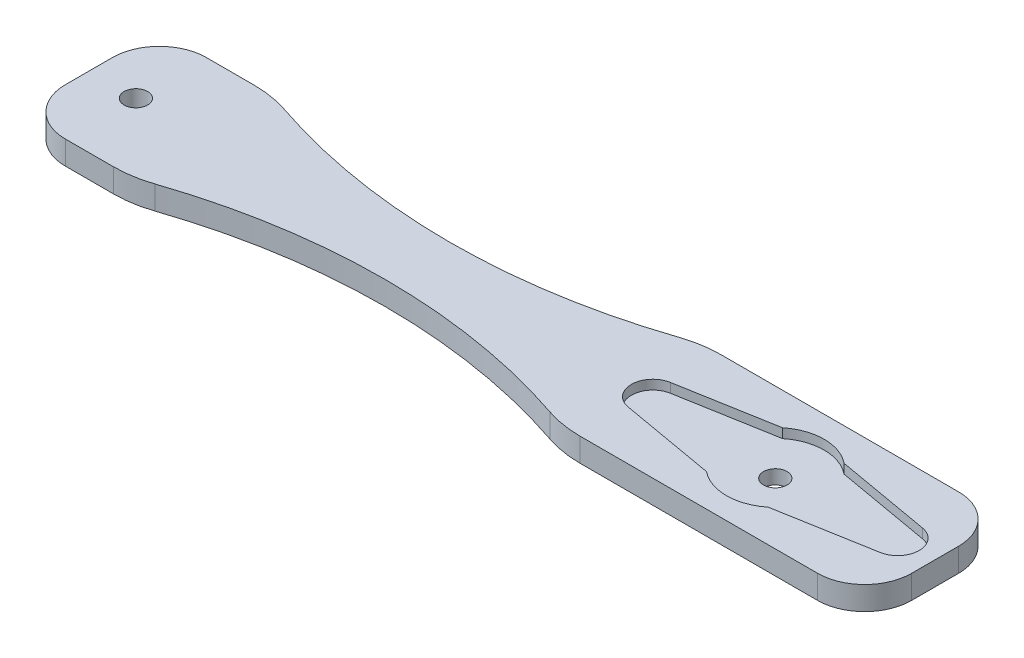
ISO-10303-21;
HEADER;
FILE_DESCRIPTION(('STEP AP214'),'2;1');
FILE_NAME('part.step','',(''),(''),'','','');
FILE_SCHEMA(('AUTOMOTIVE_DESIGN { 1 0 10303 214 1 1 1 1 }'));
ENDSEC;
DATA;
#1=APPLICATION_CONTEXT('core data for automotive mechanical design processes');
#2=APPLICATION_PROTOCOL_DEFINITION('international standard','automotive_design',2000,#1);
#3=PRODUCT_CONTEXT('',#1,'mechanical');
#4=PRODUCT('Part','Part','',(#3));
#5=PRODUCT_RELATED_PRODUCT_CATEGORY('part','',(#4));
#6=PRODUCT_DEFINITION_FORMATION('','',#4);
#7=PRODUCT_DEFINITION_CONTEXT('part definition',#1,'design');
#8=PRODUCT_DEFINITION('design','',#6,#7);
#9=PRODUCT_DEFINITION_SHAPE('','',#8);
#10=(LENGTH_UNIT() NAMED_UNIT(*) SI_UNIT(.MILLI.,.METRE.));
#11=(NAMED_UNIT(*) PLANE_ANGLE_UNIT() SI_UNIT($,.RADIAN.));
#12=(NAMED_UNIT(*) SI_UNIT($,.STERADIAN.) SOLID_ANGLE_UNIT());
#13=UNCERTAINTY_MEASURE_WITH_UNIT(LENGTH_MEASURE(1.E-05),#10,'distance_accuracy_value','');
#14=(GEOMETRIC_REPRESENTATION_CONTEXT(3) GLOBAL_UNCERTAINTY_ASSIGNED_CONTEXT((#13)) GLOBAL_UNIT_ASSIGNED_CONTEXT((#10,
#11,#12)) REPRESENTATION_CONTEXT('',''));
#15=CARTESIAN_POINT('',(0.,0.,0.));
#16=DIRECTION('',(0.,0.,1.));
#17=DIRECTION('',(1.,0.,0.));
#18=AXIS2_PLACEMENT_3D('',#15,#16,#17);
#19=CARTESIAN_POINT('',(6.35000000000004,3.175,-19.05));
#20=DIRECTION('',(0.,0.,1.));
#21=DIRECTION('',(1.,0.,0.));
#22=AXIS2_PLACEMENT_3D('',#19,#20,#21);
#23=PLANE('',#22);
#24=DIRECTION('',(-1.,0.,0.));
#25=VECTOR('',#24,1.);
#26=CARTESIAN_POINT('',(6.35000000000004,0.,-19.05));
#27=LINE('',#26,#25);
#28=CARTESIAN_POINT('',(107.95,0.,-19.05));
#29=VERTEX_POINT('',#28);
#30=CARTESIAN_POINT('',(75.8426747911721,0.,-19.05));
#31=VERTEX_POINT('',#30);
#32=EDGE_CURVE('E304',#29,#31,#27,.T.);
#33=ORIENTED_EDGE('',*,*,#32,.T.);
#34=DIRECTION('',(0.,1.,0.));
#35=VECTOR('',#34,1.);
#36=CARTESIAN_POINT('',(75.8426747911722,3.175,-19.05));
#37=LINE('',#36,#35);
#38=CARTESIAN_POINT('',(75.8426747911721,3.175,-19.05));
#39=VERTEX_POINT('',#38);
#40=EDGE_CURVE('E43',#31,#39,#37,.T.);
#41=ORIENTED_EDGE('',*,*,#40,.T.);
#42=DIRECTION('',(-1.,0.,0.));
#43=VECTOR('',#42,1.);
#44=CARTESIAN_POINT('',(6.35000000000004,3.175,-19.05));
#45=LINE('',#44,#43);
#46=CARTESIAN_POINT('',(107.95,3.175,-19.05));
#47=VERTEX_POINT('',#46);
#48=EDGE_CURVE('E283',#47,#39,#45,.T.);
#49=ORIENTED_EDGE('',*,*,#48,.F.);
#50=DIRECTION('',(0.,-1.,0.));
#51=VECTOR('',#50,1.);
#52=CARTESIAN_POINT('',(107.95,3.175,-19.05));
#53=LINE('',#52,#51);
#54=EDGE_CURVE('E330',#47,#29,#53,.T.);
#55=ORIENTED_EDGE('',*,*,#54,.T.);
#56=EDGE_LOOP('',(#33,#41,#49,#55));
#57=FACE_BOUND('',#56,.T.);
#58=ADVANCED_FACE('F34',(#57),#23,.F.);
#59=CARTESIAN_POINT('',(6.35000000000004,3.175,0.));
#60=DIRECTION('',(0.,0.,-1.));
#61=DIRECTION('',(-1.,0.,0.));
#62=AXIS2_PLACEMENT_3D('',#59,#60,#61);
#63=PLANE('',#62);
#64=DIRECTION('',(1.,0.,0.));
#65=VECTOR('',#64,1.);
#66=CARTESIAN_POINT('',(6.35000000000004,0.,0.));
#67=LINE('',#66,#65);
#68=CARTESIAN_POINT('',(6.35000000000004,0.,0.));
#69=VERTEX_POINT('',#68);
#70=CARTESIAN_POINT('',(12.8485787415568,0.,0.));
#71=VERTEX_POINT('',#70);
#72=EDGE_CURVE('E278',#69,#71,#67,.T.);
#73=ORIENTED_EDGE('',*,*,#72,.T.);
#74=DIRECTION('',(0.,1.,0.));
#75=VECTOR('',#74,1.);
#76=CARTESIAN_POINT('',(12.8485787415568,3.175,0.));
#77=LINE('',#76,#75);
#78=CARTESIAN_POINT('',(12.8485787415568,3.175,0.));
#79=VERTEX_POINT('',#78);
#80=EDGE_CURVE('E339',#71,#79,#77,.T.);
#81=ORIENTED_EDGE('',*,*,#80,.T.);
#82=DIRECTION('',(1.,0.,0.));
#83=VECTOR('',#82,1.);
#84=CARTESIAN_POINT('',(6.35000000000004,3.175,0.));
#85=LINE('',#84,#83);
#86=CARTESIAN_POINT('',(6.35000000000004,3.175,0.));
#87=VERTEX_POINT('',#86);
#88=EDGE_CURVE('E293',#87,#79,#85,.T.);
#89=ORIENTED_EDGE('',*,*,#88,.F.);
#90=DIRECTION('',(0.,-1.,0.));
#91=VECTOR('',#90,1.);
#92=CARTESIAN_POINT('',(6.35000000000004,3.175,0.));
#93=LINE('',#92,#91);
#94=EDGE_CURVE('E318',#87,#69,#93,.T.);
#95=ORIENTED_EDGE('',*,*,#94,.T.);
#96=EDGE_LOOP('',(#73,#81,#89,#95));
#97=FACE_BOUND('',#96,.T.);
#98=ADVANCED_FACE('F427',(#97),#63,.F.);
#99=CARTESIAN_POINT('',(107.95,3.175,-6.35));
#100=DIRECTION('',(0.,-1.,0.));
#101=DIRECTION('',(0.,0.,-1.));
#102=AXIS2_PLACEMENT_3D('',#99,#100,#101);
#103=CYLINDRICAL_SURFACE('',#102,6.35);
#104=CARTESIAN_POINT('',(107.95,0.,-6.35));
#105=DIRECTION('',(0.,1.,0.));
#106=DIRECTION('',(0.,0.,-1.));
#107=AXIS2_PLACEMENT_3D('',#104,#105,#106);
#108=CIRCLE('',#107,6.35);
#109=CARTESIAN_POINT('',(107.95,0.,0.));
#110=VERTEX_POINT('',#109);
#111=CARTESIAN_POINT('',(114.3,0.,-6.35));
#112=VERTEX_POINT('',#111);
#113=EDGE_CURVE('E262',#110,#112,#108,.T.);
#114=ORIENTED_EDGE('',*,*,#113,.T.);
#115=DIRECTION('',(0.,-1.,0.));
#116=VECTOR('',#115,1.);
#117=CARTESIAN_POINT('',(114.3,3.175,-6.35));
#118=LINE('',#117,#116);
#119=CARTESIAN_POINT('',(114.3,3.175,-6.35));
#120=VERTEX_POINT('',#119);
#121=EDGE_CURVE('E336',#120,#112,#118,.T.);
#122=ORIENTED_EDGE('',*,*,#121,.F.);
#123=CARTESIAN_POINT('',(107.95,3.175,-6.35));
#124=DIRECTION('',(0.,1.,0.));
#125=DIRECTION('',(0.,0.,-1.));
#126=AXIS2_PLACEMENT_3D('',#123,#124,#125);
#127=CIRCLE('',#126,6.35);
#128=CARTESIAN_POINT('',(107.95,3.175,0.));
#129=VERTEX_POINT('',#128);
#130=EDGE_CURVE('E274',#129,#120,#127,.T.);
#131=ORIENTED_EDGE('',*,*,#130,.F.);
#132=DIRECTION('',(0.,-1.,0.));
#133=VECTOR('',#132,1.);
#134=CARTESIAN_POINT('',(107.95,3.175,0.));
#135=LINE('',#134,#133);
#136=EDGE_CURVE('E296',#129,#110,#135,.T.);
#137=ORIENTED_EDGE('',*,*,#136,.T.);
#138=EDGE_LOOP('',(#114,#122,#131,#137));
#139=FACE_BOUND('',#138,.T.);
#140=ADVANCED_FACE('F433',(#139),#103,.T.);
#141=CARTESIAN_POINT('',(114.3,3.175,-6.35));
#142=DIRECTION('',(-1.,0.,0.));
#143=DIRECTION('',(0.,0.,1.));
#144=AXIS2_PLACEMENT_3D('',#141,#142,#143);
#145=PLANE('',#144);
#146=DIRECTION('',(0.,0.,-1.));
#147=VECTOR('',#146,1.);
#148=CARTESIAN_POINT('',(114.3,0.,-6.35));
#149=LINE('',#148,#147);
#150=CARTESIAN_POINT('',(114.3,0.,-12.7));
#151=VERTEX_POINT('',#150);
#152=EDGE_CURVE('E299',#112,#151,#149,.T.);
#153=ORIENTED_EDGE('',*,*,#152,.T.);
#154=DIRECTION('',(0.,-1.,0.));
#155=VECTOR('',#154,1.);
#156=CARTESIAN_POINT('',(114.3,3.175,-12.7));
#157=LINE('',#156,#155);
#158=CARTESIAN_POINT('',(114.3,3.175,-12.7));
#159=VERTEX_POINT('',#158);
#160=EDGE_CURVE('E333',#159,#151,#157,.T.);
#161=ORIENTED_EDGE('',*,*,#160,.F.);
#162=DIRECTION('',(0.,0.,-1.));
#163=VECTOR('',#162,1.);
#164=CARTESIAN_POINT('',(114.3,3.175,-6.35));
#165=LINE('',#164,#163);
#166=EDGE_CURVE('E277',#120,#159,#165,.T.);
#167=ORIENTED_EDGE('',*,*,#166,.F.);
#168=ORIENTED_EDGE('',*,*,#121,.T.);
#169=EDGE_LOOP('',(#153,#161,#167,#168));
#170=FACE_BOUND('',#169,.T.);
#171=ADVANCED_FACE('F447',(#170),#145,.F.);
#172=CARTESIAN_POINT('',(107.95,3.175,-12.7));
#173=DIRECTION('',(0.,-1.,0.));
#174=DIRECTION('',(0.,0.,-1.));
#175=AXIS2_PLACEMENT_3D('',#172,#173,#174);
#176=CYLINDRICAL_SURFACE('',#175,6.35);
#177=CARTESIAN_POINT('',(107.95,0.,-12.7));
#178=DIRECTION('',(0.,1.,0.));
#179=DIRECTION('',(0.,0.,1.));
#180=AXIS2_PLACEMENT_3D('',#177,#178,#179);
#181=CIRCLE('',#180,6.35);
#182=EDGE_CURVE('E301',#151,#29,#181,.T.);
#183=ORIENTED_EDGE('',*,*,#182,.T.);
#184=ORIENTED_EDGE('',*,*,#54,.F.);
#185=CARTESIAN_POINT('',(107.95,3.175,-12.7));
#186=DIRECTION('',(0.,1.,0.));
#187=DIRECTION('',(0.,0.,1.));
#188=AXIS2_PLACEMENT_3D('',#185,#186,#187);
#189=CIRCLE('',#188,6.35);
#190=EDGE_CURVE('E280',#159,#47,#189,.T.);
#191=ORIENTED_EDGE('',*,*,#190,.F.);
#192=ORIENTED_EDGE('',*,*,#160,.T.);
#193=EDGE_LOOP('',(#183,#184,#191,#192));
#194=FACE_BOUND('',#193,.T.);
#195=ADVANCED_FACE('F384',(#194),#176,.T.);
#196=CARTESIAN_POINT('',(12.8485787415568,3.175,-19.05));
#197=VERTEX_POINT('',#196);
#198=CARTESIAN_POINT('',(6.35000000000004,3.175,-19.05));
#199=VERTEX_POINT('',#198);
#200=EDGE_CURVE('E282',#197,#199,#45,.T.);
#201=ORIENTED_EDGE('',*,*,#200,.F.);
#202=DIRECTION('',(0.,1.,0.));
#203=VECTOR('',#202,1.);
#204=CARTESIAN_POINT('',(12.8485787415568,3.175,-19.05));
#205=LINE('',#204,#203);
#206=CARTESIAN_POINT('',(12.8485787415568,0.,-19.05));
#207=VERTEX_POINT('',#206);
#208=EDGE_CURVE('E50',#197,#207,#205,.F.);
#209=ORIENTED_EDGE('',*,*,#208,.T.);
#210=CARTESIAN_POINT('',(6.35000000000004,0.,-19.05));
#211=VERTEX_POINT('',#210);
#212=EDGE_CURVE('E303',#207,#211,#27,.T.);
#213=ORIENTED_EDGE('',*,*,#212,.T.);
#214=DIRECTION('',(0.,-1.,0.));
#215=VECTOR('',#214,1.);
#216=CARTESIAN_POINT('',(6.35000000000004,3.175,-19.05));
#217=LINE('',#216,#215);
#218=EDGE_CURVE('E327',#199,#211,#217,.T.);
#219=ORIENTED_EDGE('',*,*,#218,.F.);
#220=EDGE_LOOP('',(#201,#209,#213,#219));
#221=FACE_BOUND('',#220,.T.);
#222=ADVANCED_FACE('F429',(#221),#23,.F.);
#223=CARTESIAN_POINT('',(6.35,3.175,-12.7));
#224=DIRECTION('',(0.,-1.,0.));
#225=DIRECTION('',(0.,0.,-1.));
#226=AXIS2_PLACEMENT_3D('',#223,#224,#225);
#227=CYLINDRICAL_SURFACE('',#226,6.35);
#228=CARTESIAN_POINT('',(6.35,0.,-12.7));
#229=DIRECTION('',(0.,1.,0.));
#230=DIRECTION('',(0.,0.,-1.));
#231=AXIS2_PLACEMENT_3D('',#228,#229,#230);
#232=CIRCLE('',#231,6.35);
#233=CARTESIAN_POINT('',(0.,0.,-12.7));
#234=VERTEX_POINT('',#233);
#235=EDGE_CURVE('E307',#211,#234,#232,.T.);
#236=ORIENTED_EDGE('',*,*,#235,.T.);
#237=DIRECTION('',(0.,-1.,0.));
#238=VECTOR('',#237,1.);
#239=CARTESIAN_POINT('',(0.,3.175,-12.7));
#240=LINE('',#239,#238);
#241=CARTESIAN_POINT('',(0.,3.175,-12.7));
#242=VERTEX_POINT('',#241);
#243=EDGE_CURVE('E324',#242,#234,#240,.T.);
#244=ORIENTED_EDGE('',*,*,#243,.F.);
#245=CARTESIAN_POINT('',(6.35,3.175,-12.7));
#246=DIRECTION('',(0.,1.,0.));
#247=DIRECTION('',(0.,0.,-1.));
#248=AXIS2_PLACEMENT_3D('',#245,#246,#247);
#249=CIRCLE('',#248,6.35);
#250=EDGE_CURVE('E286',#199,#242,#249,.T.);
#251=ORIENTED_EDGE('',*,*,#250,.F.);
#252=ORIENTED_EDGE('',*,*,#218,.T.);
#253=EDGE_LOOP('',(#236,#244,#251,#252));
#254=FACE_BOUND('',#253,.T.);
#255=ADVANCED_FACE('F440',(#254),#227,.T.);
#256=CARTESIAN_POINT('',(0.,3.175,-6.35000000000004));
#257=DIRECTION('',(1.,0.,0.));
#258=DIRECTION('',(0.,0.,-1.));
#259=AXIS2_PLACEMENT_3D('',#256,#257,#258);
#260=PLANE('',#259);
#261=DIRECTION('',(0.,0.,1.));
#262=VECTOR('',#261,1.);
#263=CARTESIAN_POINT('',(0.,0.,-6.35000000000004));
#264=LINE('',#263,#262);
#265=CARTESIAN_POINT('',(0.,0.,-6.35000000000004));
#266=VERTEX_POINT('',#265);
#267=EDGE_CURVE('E309',#234,#266,#264,.T.);
#268=ORIENTED_EDGE('',*,*,#267,.T.);
#269=DIRECTION('',(0.,-1.,0.));
#270=VECTOR('',#269,1.);
#271=CARTESIAN_POINT('',(0.,3.175,-6.35000000000004));
#272=LINE('',#271,#270);
#273=CARTESIAN_POINT('',(0.,3.175,-6.35000000000004));
#274=VERTEX_POINT('',#273);
#275=EDGE_CURVE('E321',#274,#266,#272,.T.);
#276=ORIENTED_EDGE('',*,*,#275,.F.);
#277=DIRECTION('',(0.,0.,1.));
#278=VECTOR('',#277,1.);
#279=CARTESIAN_POINT('',(0.,3.175,-6.35000000000004));
#280=LINE('',#279,#278);
#281=EDGE_CURVE('E288',#242,#274,#280,.T.);
#282=ORIENTED_EDGE('',*,*,#281,.F.);
#283=ORIENTED_EDGE('',*,*,#243,.T.);
#284=EDGE_LOOP('',(#268,#276,#282,#283));
#285=FACE_BOUND('',#284,.T.);
#286=ADVANCED_FACE('F445',(#285),#260,.F.);
#287=CARTESIAN_POINT('',(6.35,3.175,-6.35));
#288=DIRECTION('',(0.,-1.,0.));
#289=DIRECTION('',(0.,0.,-1.));
#290=AXIS2_PLACEMENT_3D('',#287,#288,#289);
#291=CYLINDRICAL_SURFACE('',#290,6.35);
#292=CARTESIAN_POINT('',(6.35,0.,-6.35));
#293=DIRECTION('',(0.,1.,0.));
#294=DIRECTION('',(0.,0.,-1.));
#295=AXIS2_PLACEMENT_3D('',#292,#293,#294);
#296=CIRCLE('',#295,6.35);
#297=EDGE_CURVE('E311',#266,#69,#296,.T.);
#298=ORIENTED_EDGE('',*,*,#297,.T.);
#299=ORIENTED_EDGE('',*,*,#94,.F.);
#300=CARTESIAN_POINT('',(6.35,3.175,-6.35));
#301=DIRECTION('',(0.,1.,0.));
#302=DIRECTION('',(0.,0.,-1.));
#303=AXIS2_PLACEMENT_3D('',#300,#301,#302);
#304=CIRCLE('',#303,6.35);
#305=EDGE_CURVE('E290',#274,#87,#304,.T.);
#306=ORIENTED_EDGE('',*,*,#305,.F.);
#307=ORIENTED_EDGE('',*,*,#275,.T.);
#308=EDGE_LOOP('',(#298,#299,#306,#307));
#309=FACE_BOUND('',#308,.T.);
#310=ADVANCED_FACE('F463',(#309),#291,.T.);
#311=CARTESIAN_POINT('',(75.8426747911722,3.175,0.));
#312=VERTEX_POINT('',#311);
#313=EDGE_CURVE('E292',#312,#129,#85,.T.);
#314=ORIENTED_EDGE('',*,*,#313,.F.);
#315=DIRECTION('',(0.,1.,0.));
#316=VECTOR('',#315,1.);
#317=CARTESIAN_POINT('',(75.8426747911722,3.175,0.));
#318=LINE('',#317,#316);
#319=CARTESIAN_POINT('',(75.8426747911722,0.,0.));
#320=VERTEX_POINT('',#319);
#321=EDGE_CURVE('E11',#312,#320,#318,.F.);
#322=ORIENTED_EDGE('',*,*,#321,.T.);
#323=EDGE_CURVE('E313',#320,#110,#67,.T.);
#324=ORIENTED_EDGE('',*,*,#323,.T.);
#325=ORIENTED_EDGE('',*,*,#136,.F.);
#326=EDGE_LOOP('',(#314,#322,#324,#325));
#327=FACE_BOUND('',#326,.T.);
#328=ADVANCED_FACE('F436',(#327),#63,.F.);
#329=CARTESIAN_POINT('',(107.95,3.175,-6.35));
#330=DIRECTION('',(0.,-1.,0.));
#331=DIRECTION('',(0.,0.,-1.));
#332=AXIS2_PLACEMENT_3D('',#329,#330,#331);
#333=PLANE('',#332);
#334=CARTESIAN_POINT('',(6.35,3.175,-9.525));
#335=DIRECTION('',(0.,1.,0.));
#336=DIRECTION('',(0.,0.,1.));
#337=AXIS2_PLACEMENT_3D('',#334,#335,#336);
#338=CIRCLE('',#337,1.5875);
#339=CARTESIAN_POINT('',(6.35,3.175,-7.9375));
#340=VERTEX_POINT('',#339);
#341=EDGE_CURVE('E401',#340,#340,#338,.T.);
#342=ORIENTED_EDGE('',*,*,#341,.F.);
#343=EDGE_LOOP('',(#342));
#344=FACE_BOUND('',#343,.T.);
#345=DIRECTION('',(-0.984807753012208,0.,-0.173648177666932));
#346=VECTOR('',#345,1.);
#347=CARTESIAN_POINT('',(109.744274307943,3.175,-12.3848817147463));
#348=LINE('',#347,#346);
#349=CARTESIAN_POINT('',(109.744274307943,3.175,-12.3848817147463));
#350=VERTEX_POINT('',#349);
#351=CARTESIAN_POINT('',(96.8685696323177,3.175,-14.6552158446932));
#352=VERTEX_POINT('',#351);
#353=EDGE_CURVE('E244',#350,#352,#348,.T.);
#354=ORIENTED_EDGE('',*,*,#353,.F.);
#355=CARTESIAN_POINT('',(109.239999999998,3.175,-9.5249999999988));
#356=DIRECTION('',(0.,1.,0.));
#357=DIRECTION('',(0.,0.,-1.));
#358=AXIS2_PLACEMENT_3D('',#355,#356,#357);
#359=CIRCLE('',#358,2.904);
#360=CARTESIAN_POINT('',(109.744274307943,3.175,-6.66511828525134));
#361=VERTEX_POINT('',#360);
#362=EDGE_CURVE('E203',#361,#350,#359,.T.);
#363=ORIENTED_EDGE('',*,*,#362,.F.);
#364=DIRECTION('',(0.984807753012211,0.,-0.173648177666915));
#365=VECTOR('',#364,1.);
#366=CARTESIAN_POINT('',(109.744274307943,3.175,-6.66511828525134));
#367=LINE('',#366,#365);
#368=CARTESIAN_POINT('',(96.8685696323176,3.175,-4.39478415530464));
#369=VERTEX_POINT('',#368);
#370=EDGE_CURVE('E221',#369,#361,#367,.T.);
#371=ORIENTED_EDGE('',*,*,#370,.F.);
#372=CARTESIAN_POINT('',(92.7099999999984,3.175,-9.52499999999895));
#373=DIRECTION('',(0.,1.,0.));
#374=DIRECTION('',(0.,0.,1.));
#375=AXIS2_PLACEMENT_3D('',#372,#373,#374);
#376=CIRCLE('',#375,6.604);
#377=CARTESIAN_POINT('',(88.5514303676791,3.175,-4.39478415530472));
#378=VERTEX_POINT('',#377);
#379=EDGE_CURVE('E224',#378,#369,#376,.T.);
#380=ORIENTED_EDGE('',*,*,#379,.F.);
#381=DIRECTION('',(0.984807753012208,0.,0.173648177666932));
#382=VECTOR('',#381,1.);
#383=CARTESIAN_POINT('',(75.6757256920536,3.175,-6.66511828525165));
#384=LINE('',#383,#382);
#385=CARTESIAN_POINT('',(75.6757256920536,3.175,-6.66511828525165));
#386=VERTEX_POINT('',#385);
#387=EDGE_CURVE('E255',#386,#378,#384,.T.);
#388=ORIENTED_EDGE('',*,*,#387,.F.);
#389=CARTESIAN_POINT('',(76.1799999999984,3.175,-9.5249999999991));
#390=DIRECTION('',(0.,1.,0.));
#391=DIRECTION('',(0.,0.,1.));
#392=AXIS2_PLACEMENT_3D('',#389,#390,#391);
#393=CIRCLE('',#392,2.904);
#394=CARTESIAN_POINT('',(75.6757256920537,3.175,-12.3848817147466));
#395=VERTEX_POINT('',#394);
#396=EDGE_CURVE('E252',#395,#386,#393,.T.);
#397=ORIENTED_EDGE('',*,*,#396,.F.);
#398=DIRECTION('',(-0.984807753012211,0.,0.173648177666915));
#399=VECTOR('',#398,1.);
#400=CARTESIAN_POINT('',(75.6757256920537,3.175,-12.3848817147466));
#401=LINE('',#400,#399);
#402=CARTESIAN_POINT('',(88.5514303676792,3.175,-14.6552158446933));
#403=VERTEX_POINT('',#402);
#404=EDGE_CURVE('E249',#403,#395,#401,.T.);
#405=ORIENTED_EDGE('',*,*,#404,.F.);
#406=CARTESIAN_POINT('',(92.7099999999984,3.175,-9.52499999999895));
#407=DIRECTION('',(0.,1.,0.));
#408=DIRECTION('',(0.,0.,1.));
#409=AXIS2_PLACEMENT_3D('',#406,#407,#408);
#410=CIRCLE('',#409,6.604);
#411=EDGE_CURVE('E246',#352,#403,#410,.T.);
#412=ORIENTED_EDGE('',*,*,#411,.F.);
#413=EDGE_LOOP('',(#354,#363,#371,#380,#388,#397,#405,#412));
#414=FACE_BOUND('',#413,.T.);
#415=ORIENTED_EDGE('',*,*,#88,.T.);
#416=CARTESIAN_POINT('',(12.8485787415568,3.175,-15.));
#417=DIRECTION('',(0.,-1.,0.));
#418=DIRECTION('',(0.,0.,-1.));
#419=AXIS2_PLACEMENT_3D('',#416,#417,#418);
#420=CIRCLE('',#419,15.);
#421=CARTESIAN_POINT('',(17.6435851972159,3.175,-0.787051217633006));
#422=VERTEX_POINT('',#421);
#423=EDGE_CURVE('E348',#79,#422,#420,.F.);
#424=ORIENTED_EDGE('',*,*,#423,.T.);
#425=CARTESIAN_POINT('',(44.3456267663645,3.175,78.3608608272062));
#426=DIRECTION('',(0.,1.,0.));
#427=DIRECTION('',(0.,0.,-1.));
#428=AXIS2_PLACEMENT_3D('',#425,#426,#427);
#429=CIRCLE('',#428,83.5307787885288);
#430=CARTESIAN_POINT('',(71.0476683355131,3.175,-0.787051217633006));
#431=VERTEX_POINT('',#430);
#432=EDGE_CURVE('E403',#431,#422,#429,.T.);
#433=ORIENTED_EDGE('',*,*,#432,.F.);
#434=CARTESIAN_POINT('',(75.8426747911722,3.175,-15.));
#435=DIRECTION('',(0.,-1.,0.));
#436=DIRECTION('',(0.,0.,-1.));
#437=AXIS2_PLACEMENT_3D('',#434,#435,#436);
#438=CIRCLE('',#437,15.);
#439=EDGE_CURVE('E342',#431,#312,#438,.F.);
#440=ORIENTED_EDGE('',*,*,#439,.T.);
#441=ORIENTED_EDGE('',*,*,#313,.T.);
#442=ORIENTED_EDGE('',*,*,#130,.T.);
#443=ORIENTED_EDGE('',*,*,#166,.T.);
#444=ORIENTED_EDGE('',*,*,#190,.T.);
#445=ORIENTED_EDGE('',*,*,#48,.T.);
#446=CARTESIAN_POINT('',(75.8426747911722,3.175,-4.05));
#447=DIRECTION('',(0.,-1.,0.));
#448=DIRECTION('',(0.,0.,-1.));
#449=AXIS2_PLACEMENT_3D('',#446,#447,#448);
#450=CIRCLE('',#449,15.);
#451=CARTESIAN_POINT('',(71.0476683355131,3.175,-18.262948782367));
#452=VERTEX_POINT('',#451);
#453=EDGE_CURVE('E344',#39,#452,#450,.F.);
#454=ORIENTED_EDGE('',*,*,#453,.T.);
#455=CARTESIAN_POINT('',(44.3456267663645,3.175,-97.4108608272062));
#456=DIRECTION('',(0.,1.,0.));
#457=DIRECTION('',(0.,0.,1.));
#458=AXIS2_PLACEMENT_3D('',#455,#456,#457);
#459=CIRCLE('',#458,83.5307787885288);
#460=CARTESIAN_POINT('',(17.6435851972159,3.175,-18.262948782367));
#461=VERTEX_POINT('',#460);
#462=EDGE_CURVE('E398',#461,#452,#459,.T.);
#463=ORIENTED_EDGE('',*,*,#462,.F.);
#464=CARTESIAN_POINT('',(12.8485787415568,3.175,-4.05));
#465=DIRECTION('',(0.,-1.,0.));
#466=DIRECTION('',(0.,0.,-1.));
#467=AXIS2_PLACEMENT_3D('',#464,#465,#466);
#468=CIRCLE('',#467,15.);
#469=EDGE_CURVE('E346',#461,#197,#468,.F.);
#470=ORIENTED_EDGE('',*,*,#469,.T.);
#471=ORIENTED_EDGE('',*,*,#200,.T.);
#472=ORIENTED_EDGE('',*,*,#250,.T.);
#473=ORIENTED_EDGE('',*,*,#281,.T.);
#474=ORIENTED_EDGE('',*,*,#305,.T.);
#475=EDGE_LOOP('',(#415,#424,#433,#440,#441,#442,#443,#444,#445,#454,#463,#470,#471,#472,#473,#474));
#476=FACE_BOUND('',#475,.T.);
#477=ADVANCED_FACE('F377',(#344,#414,#476),#333,.F.);
#478=CARTESIAN_POINT('',(107.95,0.,-6.35));
#479=DIRECTION('',(0.,-1.,0.));
#480=DIRECTION('',(0.,0.,-1.));
#481=AXIS2_PLACEMENT_3D('',#478,#479,#480);
#482=PLANE('',#481);
#483=CARTESIAN_POINT('',(92.7100000000112,0.,-9.52500000001921));
#484=DIRECTION('',(0.,1.,0.));
#485=DIRECTION('',(0.,0.,1.));
#486=AXIS2_PLACEMENT_3D('',#483,#484,#485);
#487=CIRCLE('',#486,1.58750000000001);
#488=CARTESIAN_POINT('',(92.7100000000112,0.,-7.93750000001921));
#489=VERTEX_POINT('',#488);
#490=EDGE_CURVE('E719',#489,#489,#487,.T.);
#491=ORIENTED_EDGE('',*,*,#490,.T.);
#492=EDGE_LOOP('',(#491));
#493=FACE_BOUND('',#492,.T.);
#494=CARTESIAN_POINT('',(44.3456267663645,0.,78.3608608272062));
#495=DIRECTION('',(0.,1.,0.));
#496=DIRECTION('',(0.,0.,-1.));
#497=AXIS2_PLACEMENT_3D('',#494,#495,#496);
#498=CIRCLE('',#497,83.5307787885288);
#499=CARTESIAN_POINT('',(71.0476683355131,0.,-0.787051217633006));
#500=VERTEX_POINT('',#499);
#501=CARTESIAN_POINT('',(17.6435851972159,0.,-0.787051217633006));
#502=VERTEX_POINT('',#501);
#503=EDGE_CURVE('E399',#500,#502,#498,.T.);
#504=ORIENTED_EDGE('',*,*,#503,.T.);
#505=CARTESIAN_POINT('',(12.8485787415568,0.,-15.));
#506=DIRECTION('',(0.,-1.,0.));
#507=DIRECTION('',(0.,0.,-1.));
#508=AXIS2_PLACEMENT_3D('',#505,#506,#507);
#509=CIRCLE('',#508,15.);
#510=EDGE_CURVE('E361',#502,#71,#509,.T.);
#511=ORIENTED_EDGE('',*,*,#510,.T.);
#512=ORIENTED_EDGE('',*,*,#72,.F.);
#513=ORIENTED_EDGE('',*,*,#297,.F.);
#514=ORIENTED_EDGE('',*,*,#267,.F.);
#515=ORIENTED_EDGE('',*,*,#235,.F.);
#516=ORIENTED_EDGE('',*,*,#212,.F.);
#517=CARTESIAN_POINT('',(12.8485787415568,0.,-4.05));
#518=DIRECTION('',(0.,-1.,0.));
#519=DIRECTION('',(0.,0.,-1.));
#520=AXIS2_PLACEMENT_3D('',#517,#518,#519);
#521=CIRCLE('',#520,15.);
#522=CARTESIAN_POINT('',(17.6435851972159,0.,-18.262948782367));
#523=VERTEX_POINT('',#522);
#524=EDGE_CURVE('E359',#207,#523,#521,.T.);
#525=ORIENTED_EDGE('',*,*,#524,.T.);
#526=CARTESIAN_POINT('',(44.3456267663645,0.,-97.4108608272062));
#527=DIRECTION('',(0.,1.,0.));
#528=DIRECTION('',(0.,0.,1.));
#529=AXIS2_PLACEMENT_3D('',#526,#527,#528);
#530=CIRCLE('',#529,83.5307787885288);
#531=CARTESIAN_POINT('',(71.0476683355131,0.,-18.262948782367));
#532=VERTEX_POINT('',#531);
#533=EDGE_CURVE('E392',#523,#532,#530,.T.);
#534=ORIENTED_EDGE('',*,*,#533,.T.);
#535=CARTESIAN_POINT('',(75.8426747911722,0.,-4.05));
#536=DIRECTION('',(0.,-1.,0.));
#537=DIRECTION('',(0.,0.,-1.));
#538=AXIS2_PLACEMENT_3D('',#535,#536,#537);
#539=CIRCLE('',#538,15.);
#540=EDGE_CURVE('E357',#532,#31,#539,.T.);
#541=ORIENTED_EDGE('',*,*,#540,.T.);
#542=ORIENTED_EDGE('',*,*,#32,.F.);
#543=ORIENTED_EDGE('',*,*,#182,.F.);
#544=ORIENTED_EDGE('',*,*,#152,.F.);
#545=ORIENTED_EDGE('',*,*,#113,.F.);
#546=ORIENTED_EDGE('',*,*,#323,.F.);
#547=CARTESIAN_POINT('',(75.8426747911722,0.,-15.));
#548=DIRECTION('',(0.,-1.,0.));
#549=DIRECTION('',(0.,0.,-1.));
#550=AXIS2_PLACEMENT_3D('',#547,#548,#549);
#551=CIRCLE('',#550,15.);
#552=EDGE_CURVE('E355',#320,#500,#551,.T.);
#553=ORIENTED_EDGE('',*,*,#552,.T.);
#554=EDGE_LOOP('',(#504,#511,#512,#513,#514,#515,#516,#525,#534,#541,#542,#543,#544,#545,#546,#553));
#555=FACE_BOUND('',#554,.T.);
#556=CARTESIAN_POINT('',(6.35,0.,-9.525));
#557=DIRECTION('',(0.,1.,0.));
#558=DIRECTION('',(0.,0.,1.));
#559=AXIS2_PLACEMENT_3D('',#556,#557,#558);
#560=CIRCLE('',#559,1.5875);
#561=CARTESIAN_POINT('',(6.35,0.,-7.9375));
#562=VERTEX_POINT('',#561);
#563=EDGE_CURVE('E227',#562,#562,#560,.T.);
#564=ORIENTED_EDGE('',*,*,#563,.T.);
#565=EDGE_LOOP('',(#564));
#566=FACE_BOUND('',#565,.T.);
#567=ADVANCED_FACE('F388',(#493,#555,#566),#482,.T.);
#568=CARTESIAN_POINT('',(109.239999999998,1.905,-9.5249999999988));
#569=DIRECTION('',(0.,1.,0.));
#570=DIRECTION('',(0.,0.,1.));
#571=AXIS2_PLACEMENT_3D('',#568,#569,#570);
#572=CYLINDRICAL_SURFACE('',#571,2.904);
#573=ORIENTED_EDGE('',*,*,#362,.T.);
#574=DIRECTION('',(0.,1.,0.));
#575=VECTOR('',#574,1.);
#576=CARTESIAN_POINT('',(109.744274307943,1.905,-12.3848817147463));
#577=LINE('',#576,#575);
#578=CARTESIAN_POINT('',(109.744274307943,1.905,-12.3848817147463));
#579=VERTEX_POINT('',#578);
#580=EDGE_CURVE('E196',#579,#350,#577,.T.);
#581=ORIENTED_EDGE('',*,*,#580,.F.);
#582=CARTESIAN_POINT('',(109.239999999998,1.905,-9.5249999999988));
#583=DIRECTION('',(0.,1.,0.));
#584=DIRECTION('',(0.,0.,-1.));
#585=AXIS2_PLACEMENT_3D('',#582,#583,#584);
#586=CIRCLE('',#585,2.904);
#587=CARTESIAN_POINT('',(109.744274307943,1.905,-6.66511828525134));
#588=VERTEX_POINT('',#587);
#589=EDGE_CURVE('E200',#588,#579,#586,.T.);
#590=ORIENTED_EDGE('',*,*,#589,.F.);
#591=DIRECTION('',(0.,1.,0.));
#592=VECTOR('',#591,1.);
#593=CARTESIAN_POINT('',(109.744274307943,1.905,-6.66511828525134));
#594=LINE('',#593,#592);
#595=EDGE_CURVE('E260',#588,#361,#594,.T.);
#596=ORIENTED_EDGE('',*,*,#595,.T.);
#597=EDGE_LOOP('',(#573,#581,#590,#596));
#598=FACE_BOUND('',#597,.T.);
#599=ADVANCED_FACE('F198',(#598),#572,.F.);
#600=CARTESIAN_POINT('',(109.744274307943,1.905,-6.66511828525134));
#601=DIRECTION('',(0.173648177666915,0.,0.984807753012211));
#602=DIRECTION('',(0.984807753012211,0.,-0.173648177666915));
#603=AXIS2_PLACEMENT_3D('',#600,#601,#602);
#604=PLANE('',#603);
#605=ORIENTED_EDGE('',*,*,#370,.T.);
#606=ORIENTED_EDGE('',*,*,#595,.F.);
#607=DIRECTION('',(0.984807753012211,0.,-0.173648177666915));
#608=VECTOR('',#607,1.);
#609=CARTESIAN_POINT('',(109.744274307943,1.905,-6.66511828525134));
#610=LINE('',#609,#608);
#611=CARTESIAN_POINT('',(96.8685696323176,1.905,-4.39478415530464));
#612=VERTEX_POINT('',#611);
#613=EDGE_CURVE('E208',#612,#588,#610,.T.);
#614=ORIENTED_EDGE('',*,*,#613,.F.);
#615=DIRECTION('',(0.,1.,0.));
#616=VECTOR('',#615,1.);
#617=CARTESIAN_POINT('',(96.8685696323176,1.905,-4.39478415530464));
#618=LINE('',#617,#616);
#619=EDGE_CURVE('E263',#612,#369,#618,.T.);
#620=ORIENTED_EDGE('',*,*,#619,.T.);
#621=EDGE_LOOP('',(#605,#606,#614,#620));
#622=FACE_BOUND('',#621,.T.);
#623=ADVANCED_FACE('F599',(#622),#604,.F.);
#624=CARTESIAN_POINT('',(92.7099999999984,1.905,-9.52499999999895));
#625=DIRECTION('',(0.,1.,0.));
#626=DIRECTION('',(0.,0.,1.));
#627=AXIS2_PLACEMENT_3D('',#624,#625,#626);
#628=CYLINDRICAL_SURFACE('',#627,6.604);
#629=ORIENTED_EDGE('',*,*,#379,.T.);
#630=ORIENTED_EDGE('',*,*,#619,.F.);
#631=CARTESIAN_POINT('',(92.7099999999984,1.905,-9.52499999999895));
#632=DIRECTION('',(0.,1.,0.));
#633=DIRECTION('',(0.,0.,1.));
#634=AXIS2_PLACEMENT_3D('',#631,#632,#633);
#635=CIRCLE('',#634,6.604);
#636=CARTESIAN_POINT('',(88.5514303676791,1.905,-4.39478415530472));
#637=VERTEX_POINT('',#636);
#638=EDGE_CURVE('E240',#637,#612,#635,.T.);
#639=ORIENTED_EDGE('',*,*,#638,.F.);
#640=DIRECTION('',(0.,1.,0.));
#641=VECTOR('',#640,1.);
#642=CARTESIAN_POINT('',(88.5514303676791,1.905,-4.39478415530472));
#643=LINE('',#642,#641);
#644=EDGE_CURVE('E265',#637,#378,#643,.T.);
#645=ORIENTED_EDGE('',*,*,#644,.T.);
#646=EDGE_LOOP('',(#629,#630,#639,#645));
#647=FACE_BOUND('',#646,.T.);
#648=ADVANCED_FACE('F591',(#647),#628,.F.);
#649=CARTESIAN_POINT('',(75.6757256920536,1.905,-6.66511828525165));
#650=DIRECTION('',(-0.173648177666932,0.,0.984807753012208));
#651=DIRECTION('',(0.984807753012208,0.,0.173648177666932));
#652=AXIS2_PLACEMENT_3D('',#649,#650,#651);
#653=PLANE('',#652);
#654=ORIENTED_EDGE('',*,*,#387,.T.);
#655=ORIENTED_EDGE('',*,*,#644,.F.);
#656=DIRECTION('',(0.984807753012208,0.,0.173648177666932));
#657=VECTOR('',#656,1.);
#658=CARTESIAN_POINT('',(75.6757256920536,1.905,-6.66511828525165));
#659=LINE('',#658,#657);
#660=CARTESIAN_POINT('',(75.6757256920536,1.905,-6.66511828525165));
#661=VERTEX_POINT('',#660);
#662=EDGE_CURVE('E237',#661,#637,#659,.T.);
#663=ORIENTED_EDGE('',*,*,#662,.F.);
#664=DIRECTION('',(0.,1.,0.));
#665=VECTOR('',#664,1.);
#666=CARTESIAN_POINT('',(75.6757256920536,1.905,-6.66511828525165));
#667=LINE('',#666,#665);
#668=EDGE_CURVE('E267',#661,#386,#667,.T.);
#669=ORIENTED_EDGE('',*,*,#668,.T.);
#670=EDGE_LOOP('',(#654,#655,#663,#669));
#671=FACE_BOUND('',#670,.T.);
#672=ADVANCED_FACE('F583',(#671),#653,.F.);
#673=CARTESIAN_POINT('',(76.1799999999984,1.905,-9.5249999999991));
#674=DIRECTION('',(0.,1.,0.));
#675=DIRECTION('',(0.,0.,1.));
#676=AXIS2_PLACEMENT_3D('',#673,#674,#675);
#677=CYLINDRICAL_SURFACE('',#676,2.904);
#678=ORIENTED_EDGE('',*,*,#396,.T.);
#679=ORIENTED_EDGE('',*,*,#668,.F.);
#680=CARTESIAN_POINT('',(76.1799999999984,1.905,-9.5249999999991));
#681=DIRECTION('',(0.,1.,0.));
#682=DIRECTION('',(0.,0.,1.));
#683=AXIS2_PLACEMENT_3D('',#680,#681,#682);
#684=CIRCLE('',#683,2.904);
#685=CARTESIAN_POINT('',(75.6757256920537,1.905,-12.3848817147466));
#686=VERTEX_POINT('',#685);
#687=EDGE_CURVE('E234',#686,#661,#684,.T.);
#688=ORIENTED_EDGE('',*,*,#687,.F.);
#689=DIRECTION('',(0.,1.,0.));
#690=VECTOR('',#689,1.);
#691=CARTESIAN_POINT('',(75.6757256920537,1.905,-12.3848817147466));
#692=LINE('',#691,#690);
#693=EDGE_CURVE('E269',#686,#395,#692,.T.);
#694=ORIENTED_EDGE('',*,*,#693,.T.);
#695=EDGE_LOOP('',(#678,#679,#688,#694));
#696=FACE_BOUND('',#695,.T.);
#697=ADVANCED_FACE('F575',(#696),#677,.F.);
#698=CARTESIAN_POINT('',(75.6757256920537,1.905,-12.3848817147466));
#699=DIRECTION('',(-0.173648177666915,0.,-0.984807753012211));
#700=DIRECTION('',(-0.984807753012211,0.,0.173648177666915));
#701=AXIS2_PLACEMENT_3D('',#698,#699,#700);
#702=PLANE('',#701);
#703=ORIENTED_EDGE('',*,*,#404,.T.);
#704=ORIENTED_EDGE('',*,*,#693,.F.);
#705=DIRECTION('',(-0.984807753012211,0.,0.173648177666915));
#706=VECTOR('',#705,1.);
#707=CARTESIAN_POINT('',(75.6757256920537,1.905,-12.3848817147466));
#708=LINE('',#707,#706);
#709=CARTESIAN_POINT('',(88.5514303676792,1.905,-14.6552158446933));
#710=VERTEX_POINT('',#709);
#711=EDGE_CURVE('E231',#710,#686,#708,.T.);
#712=ORIENTED_EDGE('',*,*,#711,.F.);
#713=DIRECTION('',(0.,1.,0.));
#714=VECTOR('',#713,1.);
#715=CARTESIAN_POINT('',(88.5514303676792,1.905,-14.6552158446933));
#716=LINE('',#715,#714);
#717=EDGE_CURVE('E271',#710,#403,#716,.T.);
#718=ORIENTED_EDGE('',*,*,#717,.T.);
#719=EDGE_LOOP('',(#703,#704,#712,#718));
#720=FACE_BOUND('',#719,.T.);
#721=ADVANCED_FACE('F567',(#720),#702,.F.);
#722=CARTESIAN_POINT('',(92.7099999999984,1.905,-9.52499999999895));
#723=DIRECTION('',(0.,1.,0.));
#724=DIRECTION('',(0.,0.,1.));
#725=AXIS2_PLACEMENT_3D('',#722,#723,#724);
#726=CYLINDRICAL_SURFACE('',#725,6.604);
#727=ORIENTED_EDGE('',*,*,#411,.T.);
#728=ORIENTED_EDGE('',*,*,#717,.F.);
#729=CARTESIAN_POINT('',(92.7099999999984,1.905,-9.52499999999895));
#730=DIRECTION('',(0.,1.,0.));
#731=DIRECTION('',(0.,0.,1.));
#732=AXIS2_PLACEMENT_3D('',#729,#730,#731);
#733=CIRCLE('',#732,6.604);
#734=CARTESIAN_POINT('',(96.8685696323177,1.905,-14.6552158446932));
#735=VERTEX_POINT('',#734);
#736=EDGE_CURVE('E216',#735,#710,#733,.T.);
#737=ORIENTED_EDGE('',*,*,#736,.F.);
#738=DIRECTION('',(0.,1.,0.));
#739=VECTOR('',#738,1.);
#740=CARTESIAN_POINT('',(96.8685696323177,1.905,-14.6552158446932));
#741=LINE('',#740,#739);
#742=EDGE_CURVE('E207',#735,#352,#741,.T.);
#743=ORIENTED_EDGE('',*,*,#742,.T.);
#744=EDGE_LOOP('',(#727,#728,#737,#743));
#745=FACE_BOUND('',#744,.T.);
#746=ADVANCED_FACE('F561',(#745),#726,.F.);
#747=CARTESIAN_POINT('',(109.744274307943,1.905,-12.3848817147463));
#748=DIRECTION('',(0.173648177666932,0.,-0.984807753012208));
#749=DIRECTION('',(-0.984807753012208,0.,-0.173648177666932));
#750=AXIS2_PLACEMENT_3D('',#747,#748,#749);
#751=PLANE('',#750);
#752=ORIENTED_EDGE('',*,*,#353,.T.);
#753=ORIENTED_EDGE('',*,*,#742,.F.);
#754=DIRECTION('',(-0.984807753012208,0.,-0.173648177666932));
#755=VECTOR('',#754,1.);
#756=CARTESIAN_POINT('',(109.744274307943,1.905,-12.3848817147463));
#757=LINE('',#756,#755);
#758=EDGE_CURVE('E211',#579,#735,#757,.T.);
#759=ORIENTED_EDGE('',*,*,#758,.F.);
#760=ORIENTED_EDGE('',*,*,#580,.T.);
#761=EDGE_LOOP('',(#752,#753,#759,#760));
#762=FACE_BOUND('',#761,.T.);
#763=ADVANCED_FACE('F212',(#762),#751,.F.);
#764=CARTESIAN_POINT('',(109.239999999998,1.905,-9.5249999999988));
#765=DIRECTION('',(0.,-1.,0.));
#766=DIRECTION('',(0.,0.,-1.));
#767=AXIS2_PLACEMENT_3D('',#764,#765,#766);
#768=PLANE('',#767);
#769=CARTESIAN_POINT('',(92.7100000000112,1.905,-9.52500000001921));
#770=DIRECTION('',(0.,-1.,0.));
#771=DIRECTION('',(0.,0.,-1.));
#772=AXIS2_PLACEMENT_3D('',#769,#770,#771);
#773=CIRCLE('',#772,1.58750000000001);
#774=CARTESIAN_POINT('',(92.7100000000112,1.905,-11.1125000000192));
#775=VERTEX_POINT('',#774);
#776=EDGE_CURVE('E38',#775,#775,#773,.T.);
#777=ORIENTED_EDGE('',*,*,#776,.T.);
#778=EDGE_LOOP('',(#777));
#779=FACE_BOUND('',#778,.T.);
#780=ORIENTED_EDGE('',*,*,#589,.T.);
#781=ORIENTED_EDGE('',*,*,#758,.T.);
#782=ORIENTED_EDGE('',*,*,#736,.T.);
#783=ORIENTED_EDGE('',*,*,#711,.T.);
#784=ORIENTED_EDGE('',*,*,#687,.T.);
#785=ORIENTED_EDGE('',*,*,#662,.T.);
#786=ORIENTED_EDGE('',*,*,#638,.T.);
#787=ORIENTED_EDGE('',*,*,#613,.T.);
#788=EDGE_LOOP('',(#780,#781,#782,#783,#784,#785,#786,#787));
#789=FACE_BOUND('',#788,.T.);
#790=ADVANCED_FACE('F218',(#779,#789),#768,.F.);
#791=CARTESIAN_POINT('',(6.35,3.175,-9.525));
#792=DIRECTION('',(0.,1.,0.));
#793=DIRECTION('',(0.,0.,1.));
#794=AXIS2_PLACEMENT_3D('',#791,#792,#793);
#795=CYLINDRICAL_SURFACE('',#794,1.5875);
#796=ORIENTED_EDGE('',*,*,#563,.F.);
#797=EDGE_LOOP('',(#796));
#798=FACE_BOUND('',#797,.T.);
#799=ORIENTED_EDGE('',*,*,#341,.T.);
#800=EDGE_LOOP('',(#799));
#801=FACE_BOUND('',#800,.T.);
#802=ADVANCED_FACE('F414',(#798,#801),#795,.F.);
#803=CARTESIAN_POINT('',(44.3456267663645,0.,78.3608608272062));
#804=DIRECTION('',(0.,1.,0.));
#805=DIRECTION('',(0.,0.,1.));
#806=AXIS2_PLACEMENT_3D('',#803,#804,#805);
#807=CYLINDRICAL_SURFACE('',#806,83.5307787885288);
#808=ORIENTED_EDGE('',*,*,#432,.T.);
#809=DIRECTION('',(0.,1.,0.));
#810=VECTOR('',#809,1.);
#811=CARTESIAN_POINT('',(17.6435851972159,0.,-0.78705121763302));
#812=LINE('',#811,#810);
#813=EDGE_CURVE('E353',#422,#502,#812,.F.);
#814=ORIENTED_EDGE('',*,*,#813,.T.);
#815=ORIENTED_EDGE('',*,*,#503,.F.);
#816=DIRECTION('',(0.,1.,0.));
#817=VECTOR('',#816,1.);
#818=CARTESIAN_POINT('',(71.0476683355131,0.,-0.78705121763302));
#819=LINE('',#818,#817);
#820=EDGE_CURVE('E350',#500,#431,#819,.T.);
#821=ORIENTED_EDGE('',*,*,#820,.T.);
#822=EDGE_LOOP('',(#808,#814,#815,#821));
#823=FACE_BOUND('',#822,.T.);
#824=ADVANCED_FACE('F416',(#823),#807,.F.);
#825=CARTESIAN_POINT('',(44.3456267663645,0.,-97.4108608272062));
#826=DIRECTION('',(0.,1.,0.));
#827=DIRECTION('',(0.,0.,1.));
#828=AXIS2_PLACEMENT_3D('',#825,#826,#827);
#829=CYLINDRICAL_SURFACE('',#828,83.5307787885288);
#830=ORIENTED_EDGE('',*,*,#533,.F.);
#831=DIRECTION('',(0.,1.,0.));
#832=VECTOR('',#831,1.);
#833=CARTESIAN_POINT('',(17.6435851972159,0.,-18.262948782367));
#834=LINE('',#833,#832);
#835=EDGE_CURVE('E365',#523,#461,#834,.T.);
#836=ORIENTED_EDGE('',*,*,#835,.T.);
#837=ORIENTED_EDGE('',*,*,#462,.T.);
#838=DIRECTION('',(0.,1.,0.));
#839=VECTOR('',#838,1.);
#840=CARTESIAN_POINT('',(71.0476683355131,0.,-18.262948782367));
#841=LINE('',#840,#839);
#842=EDGE_CURVE('E363',#452,#532,#841,.F.);
#843=ORIENTED_EDGE('',*,*,#842,.T.);
#844=EDGE_LOOP('',(#830,#836,#837,#843));
#845=FACE_BOUND('',#844,.T.);
#846=ADVANCED_FACE('F396',(#845),#829,.F.);
#847=CARTESIAN_POINT('',(12.8485787415568,0.,-15.));
#848=DIRECTION('',(0.,1.,0.));
#849=DIRECTION('',(0.,0.,1.));
#850=AXIS2_PLACEMENT_3D('',#847,#848,#849);
#851=CYLINDRICAL_SURFACE('',#850,15.);
#852=ORIENTED_EDGE('',*,*,#510,.F.);
#853=ORIENTED_EDGE('',*,*,#813,.F.);
#854=ORIENTED_EDGE('',*,*,#423,.F.);
#855=ORIENTED_EDGE('',*,*,#80,.F.);
#856=EDGE_LOOP('',(#852,#853,#854,#855));
#857=FACE_BOUND('',#856,.T.);
#858=ADVANCED_FACE('F473',(#857),#851,.T.);
#859=CARTESIAN_POINT('',(12.8485787415568,0.,-4.05));
#860=DIRECTION('',(0.,1.,0.));
#861=DIRECTION('',(0.,0.,1.));
#862=AXIS2_PLACEMENT_3D('',#859,#860,#861);
#863=CYLINDRICAL_SURFACE('',#862,15.);
#864=ORIENTED_EDGE('',*,*,#524,.F.);
#865=ORIENTED_EDGE('',*,*,#208,.F.);
#866=ORIENTED_EDGE('',*,*,#469,.F.);
#867=ORIENTED_EDGE('',*,*,#835,.F.);
#868=EDGE_LOOP('',(#864,#865,#866,#867));
#869=FACE_BOUND('',#868,.T.);
#870=ADVANCED_FACE('F452',(#869),#863,.T.);
#871=CARTESIAN_POINT('',(75.8426747911722,0.,-4.05));
#872=DIRECTION('',(0.,1.,0.));
#873=DIRECTION('',(0.,0.,1.));
#874=AXIS2_PLACEMENT_3D('',#871,#872,#873);
#875=CYLINDRICAL_SURFACE('',#874,15.);
#876=ORIENTED_EDGE('',*,*,#540,.F.);
#877=ORIENTED_EDGE('',*,*,#842,.F.);
#878=ORIENTED_EDGE('',*,*,#453,.F.);
#879=ORIENTED_EDGE('',*,*,#40,.F.);
#880=EDGE_LOOP('',(#876,#877,#878,#879));
#881=FACE_BOUND('',#880,.T.);
#882=ADVANCED_FACE('F394',(#881),#875,.T.);
#883=CARTESIAN_POINT('',(75.8426747911722,0.,-15.));
#884=DIRECTION('',(0.,1.,0.));
#885=DIRECTION('',(0.,0.,1.));
#886=AXIS2_PLACEMENT_3D('',#883,#884,#885);
#887=CYLINDRICAL_SURFACE('',#886,15.);
#888=ORIENTED_EDGE('',*,*,#552,.F.);
#889=ORIENTED_EDGE('',*,*,#321,.F.);
#890=ORIENTED_EDGE('',*,*,#439,.F.);
#891=ORIENTED_EDGE('',*,*,#820,.F.);
#892=EDGE_LOOP('',(#888,#889,#890,#891));
#893=FACE_BOUND('',#892,.T.);
#894=ADVANCED_FACE('F36',(#893),#887,.T.);
#895=CARTESIAN_POINT('',(92.7100000000112,3.175,-9.52500000001921));
#896=DIRECTION('',(0.,1.,0.));
#897=DIRECTION('',(0.,0.,1.));
#898=AXIS2_PLACEMENT_3D('',#895,#896,#897);
#899=CYLINDRICAL_SURFACE('',#898,1.58750000000001);
#900=ORIENTED_EDGE('',*,*,#490,.F.);
#901=EDGE_LOOP('',(#900));
#902=FACE_BOUND('',#901,.T.);
#903=ORIENTED_EDGE('',*,*,#776,.F.);
#904=EDGE_LOOP('',(#903));
#905=FACE_BOUND('',#904,.T.);
#906=ADVANCED_FACE('F496',(#902,#905),#899,.F.);
#907=CLOSED_SHELL('',(#58,#98,#140,#171,#195,#222,#255,#286,#310,#328,#477,#567,#599,#623,#648,
#672,#697,#721,#746,#763,#790,#802,#824,#846,#858,#870,#882,#894,#906));
#908=MANIFOLD_SOLID_BREP('B2',#907);
#909=ADVANCED_BREP_SHAPE_REPRESENTATION('',(#18,#908),#14);
#910=SHAPE_DEFINITION_REPRESENTATION(#9,#909);
ENDSEC;
END-ISO-10303-21;
